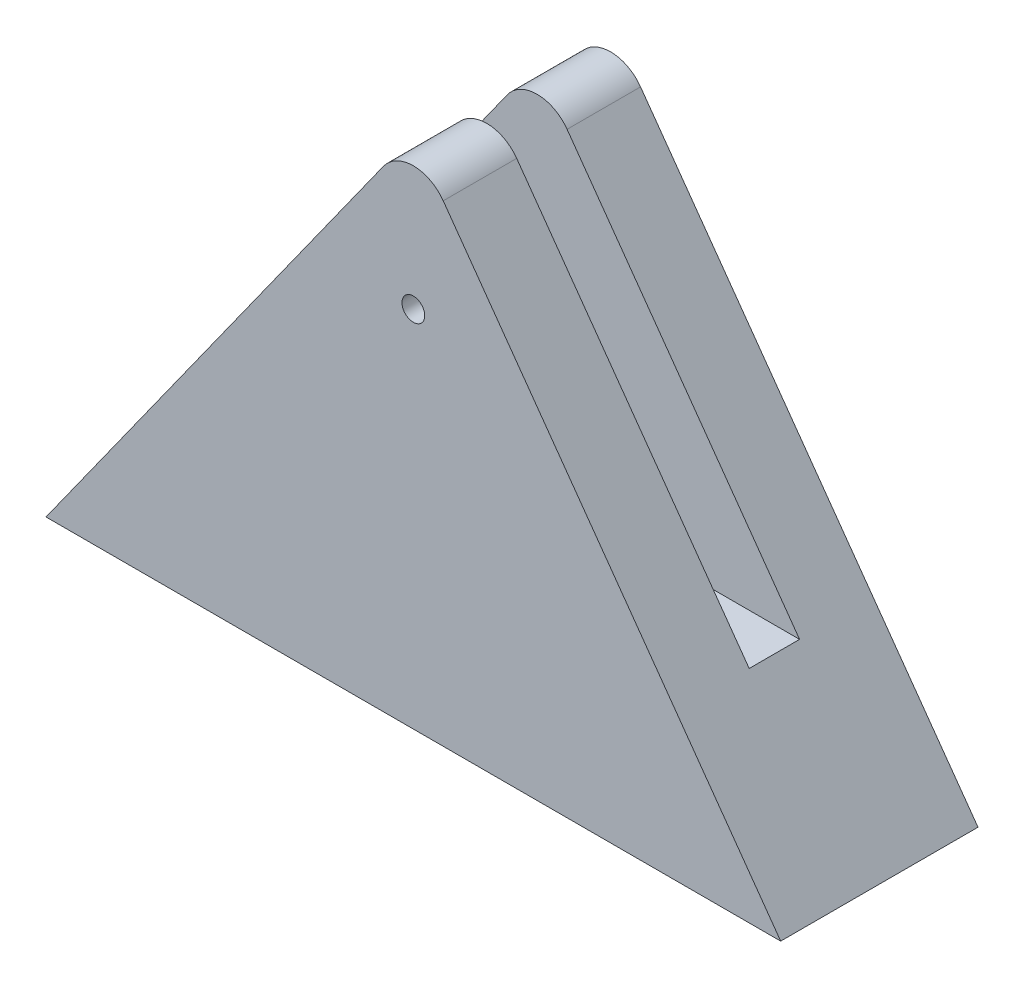
ISO-10303-21;
HEADER;
FILE_DESCRIPTION(('STEP AP214'),'2;1');
FILE_NAME('part.step','',(''),(''),'','','');
FILE_SCHEMA(('AUTOMOTIVE_DESIGN { 1 0 10303 214 1 1 1 1 }'));
ENDSEC;
DATA;
#1=APPLICATION_CONTEXT('core data for automotive mechanical design processes');
#2=APPLICATION_PROTOCOL_DEFINITION('international standard','automotive_design',2000,#1);
#3=PRODUCT_CONTEXT('',#1,'mechanical');
#4=PRODUCT('Part','Part','',(#3));
#5=PRODUCT_RELATED_PRODUCT_CATEGORY('part','',(#4));
#6=PRODUCT_DEFINITION_FORMATION('','',#4);
#7=PRODUCT_DEFINITION_CONTEXT('part definition',#1,'design');
#8=PRODUCT_DEFINITION('design','',#6,#7);
#9=PRODUCT_DEFINITION_SHAPE('','',#8);
#10=(LENGTH_UNIT() NAMED_UNIT(*) SI_UNIT(.MILLI.,.METRE.));
#11=(NAMED_UNIT(*) PLANE_ANGLE_UNIT() SI_UNIT($,.RADIAN.));
#12=(NAMED_UNIT(*) SI_UNIT($,.STERADIAN.) SOLID_ANGLE_UNIT());
#13=UNCERTAINTY_MEASURE_WITH_UNIT(LENGTH_MEASURE(1.E-05),#10,'distance_accuracy_value','');
#14=(GEOMETRIC_REPRESENTATION_CONTEXT(3) GLOBAL_UNCERTAINTY_ASSIGNED_CONTEXT((#13)) GLOBAL_UNIT_ASSIGNED_CONTEXT((#10,
#11,#12)) REPRESENTATION_CONTEXT('',''));
#15=CARTESIAN_POINT('',(0.,0.,0.));
#16=DIRECTION('',(0.,0.,1.));
#17=DIRECTION('',(1.,0.,0.));
#18=AXIS2_PLACEMENT_3D('',#15,#16,#17);
#19=CARTESIAN_POINT('',(2.14707652432533,27.319850823258,26.858));
#20=DIRECTION('',(-0.813733471206735,-0.581238193719096,0.));
#21=DIRECTION('',(0.581238193719096,-0.813733471206735,0.));
#22=AXIS2_PLACEMENT_3D('',#19,#20,#21);
#23=PLANE('',#22);
#24=DIRECTION('',(-0.581238193719096,0.813733471206735,0.));
#25=VECTOR('',#24,1.);
#26=CARTESIAN_POINT('',(2.14707652432533,27.319850823258,0.));
#27=LINE('',#26,#25);
#28=CARTESIAN_POINT('',(52.1470765243252,-42.680149176742,0.));
#29=VERTEX_POINT('',#28);
#30=CARTESIAN_POINT('',(6.21574388035901,21.6237165248109,0.));
#31=VERTEX_POINT('',#30);
#32=EDGE_CURVE('E136',#29,#31,#27,.T.);
#33=ORIENTED_EDGE('',*,*,#32,.T.);
#34=DIRECTION('',(0.,0.,-1.));
#35=VECTOR('',#34,1.);
#36=CARTESIAN_POINT('',(6.21574388035901,21.6237165248109,26.858));
#37=LINE('',#36,#35);
#38=CARTESIAN_POINT('',(6.21574388035901,21.6237165248109,10.));
#39=VERTEX_POINT('',#38);
#40=EDGE_CURVE('E48',#31,#39,#37,.F.);
#41=ORIENTED_EDGE('',*,*,#40,.T.);
#42=DIRECTION('',(-0.581238193719096,0.813733471206735,0.));
#43=VECTOR('',#42,1.);
#44=CARTESIAN_POINT('',(2.14707652432533,27.319850823258,10.));
#45=LINE('',#44,#43);
#46=CARTESIAN_POINT('',(37.861362238611,-22.680149176742,10.));
#47=VERTEX_POINT('',#46);
#48=EDGE_CURVE('E110',#47,#39,#45,.T.);
#49=ORIENTED_EDGE('',*,*,#48,.F.);
#50=DIRECTION('',(0.,0.,-1.));
#51=VECTOR('',#50,1.);
#52=CARTESIAN_POINT('',(37.861362238611,-22.680149176742,26.858));
#53=LINE('',#52,#51);
#54=CARTESIAN_POINT('',(37.861362238611,-22.680149176742,16.858));
#55=VERTEX_POINT('',#54);
#56=EDGE_CURVE('E119',#55,#47,#53,.T.);
#57=ORIENTED_EDGE('',*,*,#56,.F.);
#58=DIRECTION('',(0.581238193719096,-0.813733471206735,0.));
#59=VECTOR('',#58,1.);
#60=CARTESIAN_POINT('',(2.14707652432533,27.319850823258,16.858));
#61=LINE('',#60,#59);
#62=CARTESIAN_POINT('',(6.21574388035901,21.6237165248109,16.858));
#63=VERTEX_POINT('',#62);
#64=EDGE_CURVE('E134',#63,#55,#61,.T.);
#65=ORIENTED_EDGE('',*,*,#64,.F.);
#66=DIRECTION('',(0.,0.,-1.));
#67=VECTOR('',#66,1.);
#68=CARTESIAN_POINT('',(6.21574388035901,21.6237165248109,26.858));
#69=LINE('',#68,#67);
#70=CARTESIAN_POINT('',(6.21574388035901,21.6237165248109,26.858));
#71=VERTEX_POINT('',#70);
#72=EDGE_CURVE('E55',#63,#71,#69,.F.);
#73=ORIENTED_EDGE('',*,*,#72,.T.);
#74=DIRECTION('',(-0.581238193719096,0.813733471206735,0.));
#75=VECTOR('',#74,1.);
#76=CARTESIAN_POINT('',(2.14707652432533,27.319850823258,26.858));
#77=LINE('',#76,#75);
#78=CARTESIAN_POINT('',(52.1470765243252,-42.680149176742,26.858));
#79=VERTEX_POINT('',#78);
#80=EDGE_CURVE('E137',#79,#71,#77,.T.);
#81=ORIENTED_EDGE('',*,*,#80,.F.);
#82=DIRECTION('',(0.,0.,-1.));
#83=VECTOR('',#82,1.);
#84=CARTESIAN_POINT('',(52.1470765243252,-42.680149176742,26.858));
#85=LINE('',#84,#83);
#86=EDGE_CURVE('E144',#79,#29,#85,.T.);
#87=ORIENTED_EDGE('',*,*,#86,.T.);
#88=EDGE_LOOP('',(#33,#41,#49,#57,#65,#73,#81,#87));
#89=FACE_BOUND('',#88,.T.);
#90=ADVANCED_FACE('F33',(#89),#23,.F.);
#91=CARTESIAN_POINT('',(-47.8529234756746,-42.680149176742,26.858));
#92=DIRECTION('',(0.813733471206736,-0.581238193719096,0.));
#93=DIRECTION('',(0.581238193719096,0.813733471206736,0.));
#94=AXIS2_PLACEMENT_3D('',#91,#92,#93);
#95=PLANE('',#94);
#96=DIRECTION('',(0.581238193719096,0.813733471206736,0.));
#97=VECTOR('',#96,1.);
#98=CARTESIAN_POINT('',(-22.8871942939326,-7.72812832230316,10.));
#99=LINE('',#98,#97);
#100=CARTESIAN_POINT('',(-33.5672091899603,-22.680149176742,10.));
#101=VERTEX_POINT('',#100);
#102=CARTESIAN_POINT('',(-1.92159083170835,21.6237165248109,10.));
#103=VERTEX_POINT('',#102);
#104=EDGE_CURVE('E100',#101,#103,#99,.T.);
#105=ORIENTED_EDGE('',*,*,#104,.T.);
#106=DIRECTION('',(0.,0.,-1.));
#107=VECTOR('',#106,1.);
#108=CARTESIAN_POINT('',(-1.92159083170835,21.6237165248109,26.858));
#109=LINE('',#108,#107);
#110=CARTESIAN_POINT('',(-1.92159083170835,21.6237165248109,0.));
#111=VERTEX_POINT('',#110);
#112=EDGE_CURVE('E160',#103,#111,#109,.T.);
#113=ORIENTED_EDGE('',*,*,#112,.T.);
#114=DIRECTION('',(-0.581238193719096,-0.813733471206736,0.));
#115=VECTOR('',#114,1.);
#116=CARTESIAN_POINT('',(-47.8529234756746,-42.680149176742,0.));
#117=LINE('',#116,#115);
#118=CARTESIAN_POINT('',(-47.8529234756746,-42.680149176742,0.));
#119=VERTEX_POINT('',#118);
#120=EDGE_CURVE('E146',#111,#119,#117,.T.);
#121=ORIENTED_EDGE('',*,*,#120,.T.);
#122=DIRECTION('',(0.,0.,-1.));
#123=VECTOR('',#122,1.);
#124=CARTESIAN_POINT('',(-47.8529234756746,-42.680149176742,26.858));
#125=LINE('',#124,#123);
#126=CARTESIAN_POINT('',(-47.8529234756746,-42.680149176742,26.858));
#127=VERTEX_POINT('',#126);
#128=EDGE_CURVE('E151',#127,#119,#125,.T.);
#129=ORIENTED_EDGE('',*,*,#128,.F.);
#130=DIRECTION('',(-0.581238193719096,-0.813733471206736,0.));
#131=VECTOR('',#130,1.);
#132=CARTESIAN_POINT('',(-47.8529234756746,-42.680149176742,26.858));
#133=LINE('',#132,#131);
#134=CARTESIAN_POINT('',(-1.92159083170835,21.6237165248109,26.858));
#135=VERTEX_POINT('',#134);
#136=EDGE_CURVE('E139',#135,#127,#133,.T.);
#137=ORIENTED_EDGE('',*,*,#136,.F.);
#138=DIRECTION('',(0.,0.,-1.));
#139=VECTOR('',#138,1.);
#140=CARTESIAN_POINT('',(-1.92159083170835,21.6237165248109,26.858));
#141=LINE('',#140,#139);
#142=CARTESIAN_POINT('',(-1.92159083170835,21.6237165248109,16.858));
#143=VERTEX_POINT('',#142);
#144=EDGE_CURVE('E154',#135,#143,#141,.T.);
#145=ORIENTED_EDGE('',*,*,#144,.T.);
#146=DIRECTION('',(-0.581238193719096,-0.813733471206736,0.));
#147=VECTOR('',#146,1.);
#148=CARTESIAN_POINT('',(-22.8871942939326,-7.72812832230316,16.858));
#149=LINE('',#148,#147);
#150=CARTESIAN_POINT('',(-33.5672091899603,-22.680149176742,16.858));
#151=VERTEX_POINT('',#150);
#152=EDGE_CURVE('E120',#143,#151,#149,.T.);
#153=ORIENTED_EDGE('',*,*,#152,.T.);
#154=DIRECTION('',(0.,0.,-1.));
#155=VECTOR('',#154,1.);
#156=CARTESIAN_POINT('',(-33.5672091899603,-22.680149176742,10.));
#157=LINE('',#156,#155);
#158=EDGE_CURVE('E111',#151,#101,#157,.T.);
#159=ORIENTED_EDGE('',*,*,#158,.T.);
#160=EDGE_LOOP('',(#105,#113,#121,#129,#137,#145,#153,#159));
#161=FACE_BOUND('',#160,.T.);
#162=ADVANCED_FACE('F123',(#161),#95,.F.);
#163=CARTESIAN_POINT('',(52.1470765243252,-42.680149176742,26.858));
#164=DIRECTION('',(0.,1.,0.));
#165=DIRECTION('',(0.,0.,1.));
#166=AXIS2_PLACEMENT_3D('',#163,#164,#165);
#167=PLANE('',#166);
#168=DIRECTION('',(1.,0.,0.));
#169=VECTOR('',#168,1.);
#170=CARTESIAN_POINT('',(52.1470765243252,-42.680149176742,0.));
#171=LINE('',#170,#169);
#172=EDGE_CURVE('E140',#119,#29,#171,.T.);
#173=ORIENTED_EDGE('',*,*,#172,.T.);
#174=ORIENTED_EDGE('',*,*,#86,.F.);
#175=DIRECTION('',(1.,0.,0.));
#176=VECTOR('',#175,1.);
#177=CARTESIAN_POINT('',(52.1470765243252,-42.680149176742,26.858));
#178=LINE('',#177,#176);
#179=EDGE_CURVE('E142',#127,#79,#178,.T.);
#180=ORIENTED_EDGE('',*,*,#179,.F.);
#181=ORIENTED_EDGE('',*,*,#128,.T.);
#182=EDGE_LOOP('',(#173,#174,#180,#181));
#183=FACE_BOUND('',#182,.T.);
#184=ADVANCED_FACE('F180',(#183),#167,.F.);
#185=CARTESIAN_POINT('',(0.,0.,26.858));
#186=DIRECTION('',(0.,0.,1.));
#187=DIRECTION('',(1.,0.,0.));
#188=AXIS2_PLACEMENT_3D('',#185,#186,#187);
#189=PLANE('',#188);
#190=CARTESIAN_POINT('',(2.14707652432534,6.81985082325802,26.858));
#191=DIRECTION('',(0.,0.,1.));
#192=DIRECTION('',(1.,0.,0.));
#193=AXIS2_PLACEMENT_3D('',#190,#191,#192);
#194=CIRCLE('',#193,1.55);
#195=CARTESIAN_POINT('',(3.69707652432534,6.81985082325802,26.858));
#196=VERTEX_POINT('',#195);
#197=EDGE_CURVE('E227',#196,#196,#194,.T.);
#198=ORIENTED_EDGE('',*,*,#197,.F.);
#199=EDGE_LOOP('',(#198));
#200=FACE_BOUND('',#199,.T.);
#201=ORIENTED_EDGE('',*,*,#80,.T.);
#202=CARTESIAN_POINT('',(2.14707652432533,18.7175255562154,26.858));
#203=DIRECTION('',(0.,0.,1.));
#204=DIRECTION('',(1.,0.,0.));
#205=AXIS2_PLACEMENT_3D('',#202,#203,#204);
#206=CIRCLE('',#205,5.);
#207=EDGE_CURVE('E11',#71,#135,#206,.T.);
#208=ORIENTED_EDGE('',*,*,#207,.T.);
#209=ORIENTED_EDGE('',*,*,#136,.T.);
#210=ORIENTED_EDGE('',*,*,#179,.T.);
#211=EDGE_LOOP('',(#201,#208,#209,#210));
#212=FACE_BOUND('',#211,.T.);
#213=ADVANCED_FACE('F173',(#200,#212),#189,.T.);
#214=CARTESIAN_POINT('',(0.,0.,0.));
#215=DIRECTION('',(0.,0.,1.));
#216=DIRECTION('',(1.,0.,0.));
#217=AXIS2_PLACEMENT_3D('',#214,#215,#216);
#218=PLANE('',#217);
#219=CARTESIAN_POINT('',(2.14707652432534,6.81985082325802,0.));
#220=DIRECTION('',(0.,0.,1.));
#221=DIRECTION('',(1.,0.,0.));
#222=AXIS2_PLACEMENT_3D('',#219,#220,#221);
#223=CIRCLE('',#222,1.55);
#224=CARTESIAN_POINT('',(3.69707652432534,6.81985082325802,0.));
#225=VERTEX_POINT('',#224);
#226=EDGE_CURVE('E158',#225,#225,#223,.F.);
#227=ORIENTED_EDGE('',*,*,#226,.F.);
#228=EDGE_LOOP('',(#227));
#229=FACE_BOUND('',#228,.T.);
#230=ORIENTED_EDGE('',*,*,#120,.F.);
#231=CARTESIAN_POINT('',(2.14707652432533,18.7175255562154,0.));
#232=DIRECTION('',(0.,0.,1.));
#233=DIRECTION('',(1.,0.,0.));
#234=AXIS2_PLACEMENT_3D('',#231,#232,#233);
#235=CIRCLE('',#234,5.);
#236=EDGE_CURVE('E162',#111,#31,#235,.F.);
#237=ORIENTED_EDGE('',*,*,#236,.T.);
#238=ORIENTED_EDGE('',*,*,#32,.F.);
#239=ORIENTED_EDGE('',*,*,#172,.F.);
#240=EDGE_LOOP('',(#230,#237,#238,#239));
#241=FACE_BOUND('',#240,.T.);
#242=ADVANCED_FACE('F183',(#229,#241),#218,.F.);
#243=CARTESIAN_POINT('',(-71.9543650977184,27.319850823258,16.858));
#244=DIRECTION('',(0.,0.,-1.));
#245=DIRECTION('',(0.,1.,0.));
#246=AXIS2_PLACEMENT_3D('',#243,#244,#245);
#247=PLANE('',#246);
#248=CARTESIAN_POINT('',(2.14707652432534,6.81985082325802,16.858));
#249=DIRECTION('',(0.,0.,-1.));
#250=DIRECTION('',(0.,1.,0.));
#251=AXIS2_PLACEMENT_3D('',#248,#249,#250);
#252=CIRCLE('',#251,1.55);
#253=CARTESIAN_POINT('',(2.14707652432534,8.36985082325802,16.858));
#254=VERTEX_POINT('',#253);
#255=EDGE_CURVE('E130',#254,#254,#252,.T.);
#256=ORIENTED_EDGE('',*,*,#255,.F.);
#257=EDGE_LOOP('',(#256));
#258=FACE_BOUND('',#257,.T.);
#259=ORIENTED_EDGE('',*,*,#152,.F.);
#260=CARTESIAN_POINT('',(2.14707652432533,18.7175255562154,16.858));
#261=DIRECTION('',(0.,0.,-1.));
#262=DIRECTION('',(0.,1.,0.));
#263=AXIS2_PLACEMENT_3D('',#260,#261,#262);
#264=CIRCLE('',#263,5.);
#265=EDGE_CURVE('E41',#143,#63,#264,.T.);
#266=ORIENTED_EDGE('',*,*,#265,.T.);
#267=ORIENTED_EDGE('',*,*,#64,.T.);
#268=DIRECTION('',(1.,0.,0.));
#269=VECTOR('',#268,1.);
#270=CARTESIAN_POINT('',(-71.9543650977184,-22.680149176742,16.858));
#271=LINE('',#270,#269);
#272=EDGE_CURVE('E121',#151,#55,#271,.T.);
#273=ORIENTED_EDGE('',*,*,#272,.F.);
#274=EDGE_LOOP('',(#259,#266,#267,#273));
#275=FACE_BOUND('',#274,.T.);
#276=ADVANCED_FACE('F167',(#258,#275),#247,.T.);
#277=CARTESIAN_POINT('',(-71.9543650977184,-22.680149176742,10.));
#278=DIRECTION('',(0.,1.,0.));
#279=DIRECTION('',(0.,0.,1.));
#280=AXIS2_PLACEMENT_3D('',#277,#278,#279);
#281=PLANE('',#280);
#282=ORIENTED_EDGE('',*,*,#56,.T.);
#283=DIRECTION('',(1.,0.,0.));
#284=VECTOR('',#283,1.);
#285=CARTESIAN_POINT('',(-71.9543650977184,-22.680149176742,10.));
#286=LINE('',#285,#284);
#287=EDGE_CURVE('E103',#101,#47,#286,.T.);
#288=ORIENTED_EDGE('',*,*,#287,.F.);
#289=ORIENTED_EDGE('',*,*,#158,.F.);
#290=ORIENTED_EDGE('',*,*,#272,.T.);
#291=EDGE_LOOP('',(#282,#288,#289,#290));
#292=FACE_BOUND('',#291,.T.);
#293=ADVANCED_FACE('F115',(#292),#281,.T.);
#294=CARTESIAN_POINT('',(-71.9543650977184,27.319850823258,10.));
#295=DIRECTION('',(0.,0.,1.));
#296=DIRECTION('',(0.,-1.,0.));
#297=AXIS2_PLACEMENT_3D('',#294,#295,#296);
#298=PLANE('',#297);
#299=CARTESIAN_POINT('',(2.14707652432534,6.81985082325802,10.));
#300=DIRECTION('',(0.,0.,1.));
#301=DIRECTION('',(0.,-1.,0.));
#302=AXIS2_PLACEMENT_3D('',#299,#300,#301);
#303=CIRCLE('',#302,1.55);
#304=CARTESIAN_POINT('',(2.14707652432534,5.26985082325802,10.));
#305=VERTEX_POINT('',#304);
#306=EDGE_CURVE('E155',#305,#305,#303,.T.);
#307=ORIENTED_EDGE('',*,*,#306,.F.);
#308=EDGE_LOOP('',(#307));
#309=FACE_BOUND('',#308,.T.);
#310=ORIENTED_EDGE('',*,*,#48,.T.);
#311=CARTESIAN_POINT('',(2.14707652432533,18.7175255562154,10.));
#312=DIRECTION('',(0.,0.,1.));
#313=DIRECTION('',(0.,-1.,0.));
#314=AXIS2_PLACEMENT_3D('',#311,#312,#313);
#315=CIRCLE('',#314,5.);
#316=EDGE_CURVE('E105',#39,#103,#315,.T.);
#317=ORIENTED_EDGE('',*,*,#316,.T.);
#318=ORIENTED_EDGE('',*,*,#104,.F.);
#319=ORIENTED_EDGE('',*,*,#287,.T.);
#320=EDGE_LOOP('',(#310,#317,#318,#319));
#321=FACE_BOUND('',#320,.T.);
#322=ADVANCED_FACE('F102',(#309,#321),#298,.T.);
#323=CARTESIAN_POINT('',(2.14707652432534,6.81985082325802,-4.3840620433566));
#324=DIRECTION('',(0.,0.,1.));
#325=DIRECTION('',(1.,0.,0.));
#326=AXIS2_PLACEMENT_3D('',#323,#324,#325);
#327=CYLINDRICAL_SURFACE('',#326,1.55);
#328=ORIENTED_EDGE('',*,*,#306,.T.);
#329=EDGE_LOOP('',(#328));
#330=FACE_BOUND('',#329,.T.);
#331=ORIENTED_EDGE('',*,*,#226,.T.);
#332=EDGE_LOOP('',(#331));
#333=FACE_BOUND('',#332,.T.);
#334=ADVANCED_FACE('F192',(#330,#333),#327,.F.);
#335=ORIENTED_EDGE('',*,*,#255,.T.);
#336=EDGE_LOOP('',(#335));
#337=FACE_BOUND('',#336,.T.);
#338=ORIENTED_EDGE('',*,*,#197,.T.);
#339=EDGE_LOOP('',(#338));
#340=FACE_BOUND('',#339,.T.);
#341=ADVANCED_FACE('F187',(#337,#340),#327,.F.);
#342=CARTESIAN_POINT('',(2.14707652432533,18.7175255562154,26.858));
#343=DIRECTION('',(0.,0.,-1.));
#344=DIRECTION('',(-1.,0.,0.));
#345=AXIS2_PLACEMENT_3D('',#342,#343,#344);
#346=CYLINDRICAL_SURFACE('',#345,5.);
#347=ORIENTED_EDGE('',*,*,#316,.F.);
#348=ORIENTED_EDGE('',*,*,#40,.F.);
#349=ORIENTED_EDGE('',*,*,#236,.F.);
#350=ORIENTED_EDGE('',*,*,#112,.F.);
#351=EDGE_LOOP('',(#347,#348,#349,#350));
#352=FACE_BOUND('',#351,.T.);
#353=ADVANCED_FACE('F185',(#352),#346,.T.);
#354=CARTESIAN_POINT('',(2.14707652432533,18.7175255562154,26.858));
#355=DIRECTION('',(0.,0.,-1.));
#356=DIRECTION('',(-1.,0.,0.));
#357=AXIS2_PLACEMENT_3D('',#354,#355,#356);
#358=CYLINDRICAL_SURFACE('',#357,5.);
#359=ORIENTED_EDGE('',*,*,#207,.F.);
#360=ORIENTED_EDGE('',*,*,#72,.F.);
#361=ORIENTED_EDGE('',*,*,#265,.F.);
#362=ORIENTED_EDGE('',*,*,#144,.F.);
#363=EDGE_LOOP('',(#359,#360,#361,#362));
#364=FACE_BOUND('',#363,.T.);
#365=ADVANCED_FACE('F35',(#364),#358,.T.);
#366=CLOSED_SHELL('',(#90,#162,#184,#213,#242,#276,#293,#322,#334,#341,#353,#365));
#367=MANIFOLD_SOLID_BREP('B2',#366);
#368=ADVANCED_BREP_SHAPE_REPRESENTATION('',(#18,#367),#14);
#369=SHAPE_DEFINITION_REPRESENTATION(#9,#368);
ENDSEC;
END-ISO-10303-21;
